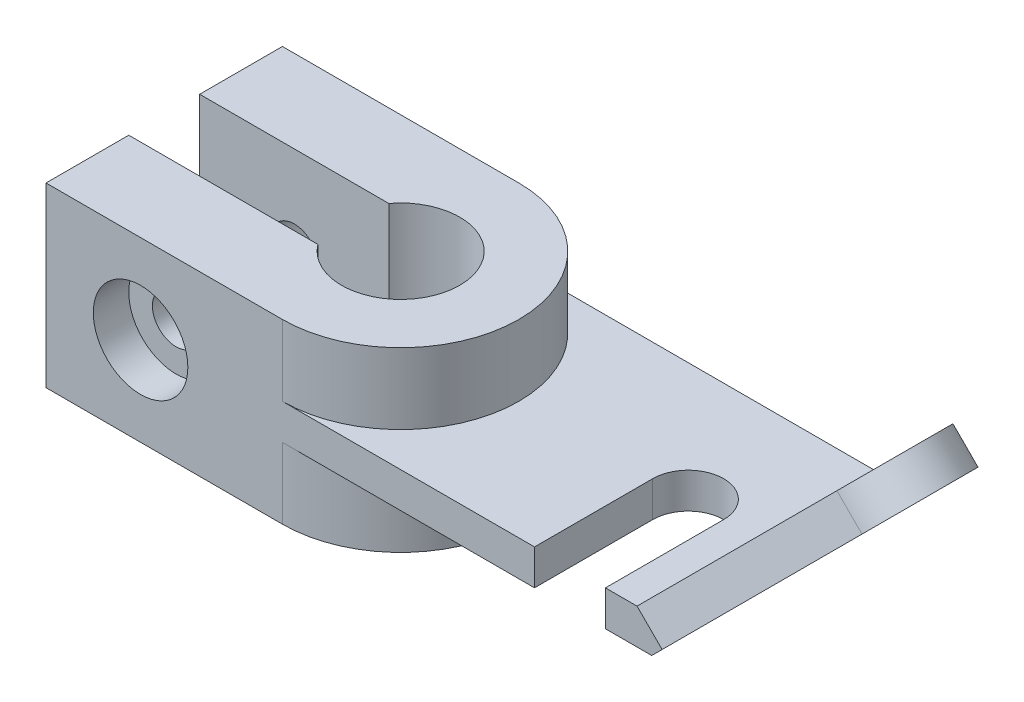
ISO-10303-21;
HEADER;
FILE_DESCRIPTION(('STEP AP214'),'2;1');
FILE_NAME('part.step','',(''),(''),'','','');
FILE_SCHEMA(('AUTOMOTIVE_DESIGN { 1 0 10303 214 1 1 1 1 }'));
ENDSEC;
DATA;
#1=APPLICATION_CONTEXT('core data for automotive mechanical design processes');
#2=APPLICATION_PROTOCOL_DEFINITION('international standard','automotive_design',2000,#1);
#3=PRODUCT_CONTEXT('',#1,'mechanical');
#4=PRODUCT('Part','Part','',(#3));
#5=PRODUCT_RELATED_PRODUCT_CATEGORY('part','',(#4));
#6=PRODUCT_DEFINITION_FORMATION('','',#4);
#7=PRODUCT_DEFINITION_CONTEXT('part definition',#1,'design');
#8=PRODUCT_DEFINITION('design','',#6,#7);
#9=PRODUCT_DEFINITION_SHAPE('','',#8);
#10=(LENGTH_UNIT() NAMED_UNIT(*) SI_UNIT(.MILLI.,.METRE.));
#11=(NAMED_UNIT(*) PLANE_ANGLE_UNIT() SI_UNIT($,.RADIAN.));
#12=(NAMED_UNIT(*) SI_UNIT($,.STERADIAN.) SOLID_ANGLE_UNIT());
#13=UNCERTAINTY_MEASURE_WITH_UNIT(LENGTH_MEASURE(1.E-05),#10,'distance_accuracy_value','');
#14=(GEOMETRIC_REPRESENTATION_CONTEXT(3) GLOBAL_UNCERTAINTY_ASSIGNED_CONTEXT((#13)) GLOBAL_UNIT_ASSIGNED_CONTEXT((#10,
#11,#12)) REPRESENTATION_CONTEXT('',''));
#15=CARTESIAN_POINT('',(0.,0.,0.));
#16=DIRECTION('',(0.,0.,1.));
#17=DIRECTION('',(1.,0.,0.));
#18=AXIS2_PLACEMENT_3D('',#15,#16,#17);
#19=CARTESIAN_POINT('',(0.,45.,30.));
#20=DIRECTION('',(0.,0.,-1.));
#21=DIRECTION('',(-1.,0.,0.));
#22=AXIS2_PLACEMENT_3D('',#19,#20,#21);
#23=PLANE('',#22);
#24=DIRECTION('',(1.,0.,0.));
#25=VECTOR('',#24,1.);
#26=CARTESIAN_POINT('',(90.,27.,30.));
#27=LINE('',#26,#25);
#28=CARTESIAN_POINT('',(81.9798487078312,27.,30.));
#29=VERTEX_POINT('',#28);
#30=CARTESIAN_POINT('',(90.,27.,30.));
#31=VERTEX_POINT('',#30);
#32=EDGE_CURVE('E248',#29,#31,#27,.T.);
#33=ORIENTED_EDGE('',*,*,#32,.F.);
#34=DIRECTION('',(0.,1.,0.));
#35=VECTOR('',#34,1.);
#36=CARTESIAN_POINT('',(81.9798487078312,0.,30.));
#37=LINE('',#36,#35);
#38=CARTESIAN_POINT('',(81.9798487078312,18.,30.));
#39=VERTEX_POINT('',#38);
#40=EDGE_CURVE('E186',#39,#29,#37,.T.);
#41=ORIENTED_EDGE('',*,*,#40,.F.);
#42=DIRECTION('',(1.,0.,0.));
#43=VECTOR('',#42,1.);
#44=CARTESIAN_POINT('',(90.,18.,30.));
#45=LINE('',#44,#43);
#46=CARTESIAN_POINT('',(90.,18.,30.));
#47=VERTEX_POINT('',#46);
#48=EDGE_CURVE('E260',#39,#47,#45,.T.);
#49=ORIENTED_EDGE('',*,*,#48,.T.);
#50=DIRECTION('',(1.,0.,0.));
#51=VECTOR('',#50,1.);
#52=CARTESIAN_POINT('',(0.,17.9999999999998,30.));
#53=LINE('',#52,#51);
#54=CARTESIAN_POINT('',(93.7279220613579,18.,30.));
#55=VERTEX_POINT('',#54);
#56=EDGE_CURVE('E209',#47,#55,#53,.T.);
#57=ORIENTED_EDGE('',*,*,#56,.T.);
#58=DIRECTION('',(0.707106781186546,0.707106781186549,0.));
#59=VECTOR('',#58,1.);
#60=CARTESIAN_POINT('',(90.0000000000001,14.2720779386421,30.));
#61=LINE('',#60,#59);
#62=CARTESIAN_POINT('',(96.363961030679,20.6360389693211,30.));
#63=VERTEX_POINT('',#62);
#64=EDGE_CURVE('E240',#55,#63,#61,.T.);
#65=ORIENTED_EDGE('',*,*,#64,.T.);
#66=DIRECTION('',(-0.707106781186549,0.707106781186546,0.));
#67=VECTOR('',#66,1.);
#68=CARTESIAN_POINT('',(96.363961030679,20.6360389693211,30.));
#69=LINE('',#68,#67);
#70=EDGE_CURVE('E234',#63,#31,#69,.T.);
#71=ORIENTED_EDGE('',*,*,#70,.T.);
#72=EDGE_LOOP('',(#33,#41,#49,#57,#65,#71));
#73=FACE_BOUND('',#72,.T.);
#74=ADVANCED_FACE('F35',(#73),#23,.F.);
#75=CARTESIAN_POINT('',(0.,45.,0.));
#76=DIRECTION('',(0.,-1.,0.));
#77=DIRECTION('',(0.,0.,-1.));
#78=AXIS2_PLACEMENT_3D('',#75,#76,#77);
#79=CYLINDRICAL_SURFACE('',#78,30.);
#80=CARTESIAN_POINT('',(0.,18.,0.));
#81=DIRECTION('',(0.,-1.,0.));
#82=DIRECTION('',(0.,0.,1.));
#83=AXIS2_PLACEMENT_3D('',#80,#81,#82);
#84=CIRCLE('',#83,30.);
#85=CARTESIAN_POINT('',(0.,18.,-30.));
#86=VERTEX_POINT('',#85);
#87=CARTESIAN_POINT('',(0.,18.,30.));
#88=VERTEX_POINT('',#87);
#89=EDGE_CURVE('E244',#86,#88,#84,.T.);
#90=ORIENTED_EDGE('',*,*,#89,.T.);
#91=DIRECTION('',(0.,-1.,0.));
#92=VECTOR('',#91,1.);
#93=CARTESIAN_POINT('',(0.,45.,30.));
#94=LINE('',#93,#92);
#95=CARTESIAN_POINT('',(0.,0.,30.));
#96=VERTEX_POINT('',#95);
#97=EDGE_CURVE('E337',#88,#96,#94,.T.);
#98=ORIENTED_EDGE('',*,*,#97,.T.);
#99=CARTESIAN_POINT('',(0.,0.,0.));
#100=DIRECTION('',(0.,1.,0.));
#101=DIRECTION('',(0.,0.,1.));
#102=AXIS2_PLACEMENT_3D('',#99,#100,#101);
#103=CIRCLE('',#102,30.);
#104=CARTESIAN_POINT('',(0.,0.,-30.));
#105=VERTEX_POINT('',#104);
#106=EDGE_CURVE('E317',#96,#105,#103,.T.);
#107=ORIENTED_EDGE('',*,*,#106,.T.);
#108=DIRECTION('',(0.,-1.,0.));
#109=VECTOR('',#108,1.);
#110=CARTESIAN_POINT('',(0.,45.,-30.));
#111=LINE('',#110,#109);
#112=EDGE_CURVE('E333',#86,#105,#111,.T.);
#113=ORIENTED_EDGE('',*,*,#112,.F.);
#114=EDGE_LOOP('',(#90,#98,#107,#113));
#115=FACE_BOUND('',#114,.T.);
#116=ADVANCED_FACE('F365',(#115),#79,.T.);
#117=CARTESIAN_POINT('',(0.,45.,0.));
#118=DIRECTION('',(0.,-1.,0.));
#119=DIRECTION('',(0.,0.,-1.));
#120=AXIS2_PLACEMENT_3D('',#117,#118,#119);
#121=CYLINDRICAL_SURFACE('',#120,15.);
#122=CARTESIAN_POINT('',(0.,0.,0.));
#123=DIRECTION('',(0.,-1.,0.));
#124=DIRECTION('',(0.,0.,1.));
#125=AXIS2_PLACEMENT_3D('',#122,#123,#124);
#126=CIRCLE('',#125,15.);
#127=CARTESIAN_POINT('',(-12.,0.,-9.));
#128=VERTEX_POINT('',#127);
#129=CARTESIAN_POINT('',(-12.,0.,9.));
#130=VERTEX_POINT('',#129);
#131=EDGE_CURVE('E288',#128,#130,#126,.T.);
#132=ORIENTED_EDGE('',*,*,#131,.T.);
#133=DIRECTION('',(0.,-1.,0.));
#134=VECTOR('',#133,1.);
#135=CARTESIAN_POINT('',(-12.,45.,9.));
#136=LINE('',#135,#134);
#137=CARTESIAN_POINT('',(-12.,45.,9.));
#138=VERTEX_POINT('',#137);
#139=EDGE_CURVE('E347',#138,#130,#136,.T.);
#140=ORIENTED_EDGE('',*,*,#139,.F.);
#141=CARTESIAN_POINT('',(0.,45.,0.));
#142=DIRECTION('',(0.,-1.,0.));
#143=DIRECTION('',(0.,0.,1.));
#144=AXIS2_PLACEMENT_3D('',#141,#142,#143);
#145=CIRCLE('',#144,15.);
#146=CARTESIAN_POINT('',(-12.,45.,-9.));
#147=VERTEX_POINT('',#146);
#148=EDGE_CURVE('E289',#147,#138,#145,.T.);
#149=ORIENTED_EDGE('',*,*,#148,.F.);
#150=DIRECTION('',(0.,-1.,0.));
#151=VECTOR('',#150,1.);
#152=CARTESIAN_POINT('',(-12.,45.,-9.));
#153=LINE('',#152,#151);
#154=EDGE_CURVE('E307',#147,#128,#153,.T.);
#155=ORIENTED_EDGE('',*,*,#154,.T.);
#156=EDGE_LOOP('',(#132,#140,#149,#155));
#157=FACE_BOUND('',#156,.T.);
#158=ADVANCED_FACE('F37',(#157),#121,.F.);
#159=CARTESIAN_POINT('',(-60.,45.,9.));
#160=DIRECTION('',(0.,0.,1.));
#161=DIRECTION('',(1.,0.,0.));
#162=AXIS2_PLACEMENT_3D('',#159,#160,#161);
#163=PLANE('',#162);
#164=CARTESIAN_POINT('',(-36.,22.5,9.));
#165=DIRECTION('',(0.,0.,1.));
#166=DIRECTION('',(1.,0.,0.));
#167=AXIS2_PLACEMENT_3D('',#164,#165,#166);
#168=CIRCLE('',#167,5.99999999999999);
#169=CARTESIAN_POINT('',(-30.,22.5,9.));
#170=VERTEX_POINT('',#169);
#171=EDGE_CURVE('E285',#170,#170,#168,.T.);
#172=ORIENTED_EDGE('',*,*,#171,.T.);
#173=EDGE_LOOP('',(#172));
#174=FACE_BOUND('',#173,.T.);
#175=DIRECTION('',(-1.,0.,0.));
#176=VECTOR('',#175,1.);
#177=CARTESIAN_POINT('',(-60.,0.,9.));
#178=LINE('',#177,#176);
#179=CARTESIAN_POINT('',(-60.,0.,9.));
#180=VERTEX_POINT('',#179);
#181=EDGE_CURVE('E310',#130,#180,#178,.T.);
#182=ORIENTED_EDGE('',*,*,#181,.T.);
#183=DIRECTION('',(0.,-1.,0.));
#184=VECTOR('',#183,1.);
#185=CARTESIAN_POINT('',(-60.,45.,9.));
#186=LINE('',#185,#184);
#187=CARTESIAN_POINT('',(-60.,45.,9.));
#188=VERTEX_POINT('',#187);
#189=EDGE_CURVE('E344',#188,#180,#186,.T.);
#190=ORIENTED_EDGE('',*,*,#189,.F.);
#191=DIRECTION('',(-1.,0.,0.));
#192=VECTOR('',#191,1.);
#193=CARTESIAN_POINT('',(-60.,45.,9.));
#194=LINE('',#193,#192);
#195=EDGE_CURVE('E292',#138,#188,#194,.T.);
#196=ORIENTED_EDGE('',*,*,#195,.F.);
#197=ORIENTED_EDGE('',*,*,#139,.T.);
#198=EDGE_LOOP('',(#182,#190,#196,#197));
#199=FACE_BOUND('',#198,.T.);
#200=ADVANCED_FACE('F422',(#174,#199),#163,.F.);
#201=CARTESIAN_POINT('',(-60.,45.,30.));
#202=DIRECTION('',(1.,0.,0.));
#203=DIRECTION('',(0.,0.,-1.));
#204=AXIS2_PLACEMENT_3D('',#201,#202,#203);
#205=PLANE('',#204);
#206=DIRECTION('',(0.,0.,1.));
#207=VECTOR('',#206,1.);
#208=CARTESIAN_POINT('',(-60.,0.,30.));
#209=LINE('',#208,#207);
#210=CARTESIAN_POINT('',(-60.,0.,30.));
#211=VERTEX_POINT('',#210);
#212=EDGE_CURVE('E312',#180,#211,#209,.T.);
#213=ORIENTED_EDGE('',*,*,#212,.T.);
#214=DIRECTION('',(0.,-1.,0.));
#215=VECTOR('',#214,1.);
#216=CARTESIAN_POINT('',(-60.,45.,30.));
#217=LINE('',#216,#215);
#218=CARTESIAN_POINT('',(-60.,45.,30.));
#219=VERTEX_POINT('',#218);
#220=EDGE_CURVE('E341',#219,#211,#217,.T.);
#221=ORIENTED_EDGE('',*,*,#220,.F.);
#222=DIRECTION('',(0.,0.,1.));
#223=VECTOR('',#222,1.);
#224=CARTESIAN_POINT('',(-60.,45.,30.));
#225=LINE('',#224,#223);
#226=EDGE_CURVE('E295',#188,#219,#225,.T.);
#227=ORIENTED_EDGE('',*,*,#226,.F.);
#228=ORIENTED_EDGE('',*,*,#189,.T.);
#229=EDGE_LOOP('',(#213,#221,#227,#228));
#230=FACE_BOUND('',#229,.T.);
#231=ADVANCED_FACE('F416',(#230),#205,.F.);
#232=CARTESIAN_POINT('',(63.9798487078312,18.,30.));
#233=VERTEX_POINT('',#232);
#234=EDGE_CURVE('E261',#88,#233,#45,.T.);
#235=ORIENTED_EDGE('',*,*,#234,.T.);
#236=DIRECTION('',(0.,1.,0.));
#237=VECTOR('',#236,1.);
#238=CARTESIAN_POINT('',(63.9798487078312,0.,30.));
#239=LINE('',#238,#237);
#240=CARTESIAN_POINT('',(63.9798487078312,27.,30.));
#241=VERTEX_POINT('',#240);
#242=EDGE_CURVE('E197',#233,#241,#239,.T.);
#243=ORIENTED_EDGE('',*,*,#242,.T.);
#244=CARTESIAN_POINT('',(0.,27.,30.));
#245=VERTEX_POINT('',#244);
#246=EDGE_CURVE('E250',#245,#241,#27,.T.);
#247=ORIENTED_EDGE('',*,*,#246,.F.);
#248=CARTESIAN_POINT('',(0.,45.,30.));
#249=VERTEX_POINT('',#248);
#250=EDGE_CURVE('E338',#249,#245,#94,.T.);
#251=ORIENTED_EDGE('',*,*,#250,.F.);
#252=DIRECTION('',(1.,0.,0.));
#253=VECTOR('',#252,1.);
#254=CARTESIAN_POINT('',(0.,45.,30.));
#255=LINE('',#254,#253);
#256=EDGE_CURVE('E297',#219,#249,#255,.T.);
#257=ORIENTED_EDGE('',*,*,#256,.F.);
#258=ORIENTED_EDGE('',*,*,#220,.T.);
#259=DIRECTION('',(1.,0.,0.));
#260=VECTOR('',#259,1.);
#261=CARTESIAN_POINT('',(0.,0.,30.));
#262=LINE('',#261,#260);
#263=EDGE_CURVE('E314',#211,#96,#262,.T.);
#264=ORIENTED_EDGE('',*,*,#263,.T.);
#265=ORIENTED_EDGE('',*,*,#97,.F.);
#266=EDGE_LOOP('',(#235,#243,#247,#251,#257,#258,#264,#265));
#267=FACE_BOUND('',#266,.T.);
#268=CARTESIAN_POINT('',(-36.,22.5,30.));
#269=DIRECTION('',(0.,0.,1.));
#270=DIRECTION('',(1.,0.,0.));
#271=AXIS2_PLACEMENT_3D('',#268,#269,#270);
#272=CIRCLE('',#271,12.);
#273=CARTESIAN_POINT('',(-24.,22.5,30.));
#274=VERTEX_POINT('',#273);
#275=EDGE_CURVE('E276',#274,#274,#272,.T.);
#276=ORIENTED_EDGE('',*,*,#275,.F.);
#277=EDGE_LOOP('',(#276));
#278=FACE_BOUND('',#277,.T.);
#279=ADVANCED_FACE('F360',(#267,#278),#23,.F.);
#280=ORIENTED_EDGE('',*,*,#250,.T.);
#281=CARTESIAN_POINT('',(0.,27.,0.));
#282=DIRECTION('',(0.,-1.,0.));
#283=DIRECTION('',(0.,0.,1.));
#284=AXIS2_PLACEMENT_3D('',#281,#282,#283);
#285=CIRCLE('',#284,30.);
#286=CARTESIAN_POINT('',(0.,27.,-30.));
#287=VERTEX_POINT('',#286);
#288=EDGE_CURVE('E245',#287,#245,#285,.T.);
#289=ORIENTED_EDGE('',*,*,#288,.F.);
#290=CARTESIAN_POINT('',(0.,45.,-30.));
#291=VERTEX_POINT('',#290);
#292=EDGE_CURVE('E334',#291,#287,#111,.T.);
#293=ORIENTED_EDGE('',*,*,#292,.F.);
#294=CARTESIAN_POINT('',(0.,45.,0.));
#295=DIRECTION('',(0.,1.,0.));
#296=DIRECTION('',(0.,0.,1.));
#297=AXIS2_PLACEMENT_3D('',#294,#295,#296);
#298=CIRCLE('',#297,30.);
#299=EDGE_CURVE('E299',#249,#291,#298,.T.);
#300=ORIENTED_EDGE('',*,*,#299,.F.);
#301=EDGE_LOOP('',(#280,#289,#293,#300));
#302=FACE_BOUND('',#301,.T.);
#303=ADVANCED_FACE('F413',(#302),#79,.T.);
#304=CARTESIAN_POINT('',(0.,45.,-30.));
#305=DIRECTION('',(0.,0.,1.));
#306=DIRECTION('',(1.,0.,0.));
#307=AXIS2_PLACEMENT_3D('',#304,#305,#306);
#308=PLANE('',#307);
#309=DIRECTION('',(-1.,0.,0.));
#310=VECTOR('',#309,1.);
#311=CARTESIAN_POINT('',(0.,17.9999999999998,-30.));
#312=LINE('',#311,#310);
#313=CARTESIAN_POINT('',(93.7279220613579,18.,-30.));
#314=VERTEX_POINT('',#313);
#315=CARTESIAN_POINT('',(90.,18.,-30.));
#316=VERTEX_POINT('',#315);
#317=EDGE_CURVE('E58',#314,#316,#312,.T.);
#318=ORIENTED_EDGE('',*,*,#317,.T.);
#319=DIRECTION('',(-1.,0.,0.));
#320=VECTOR('',#319,1.);
#321=CARTESIAN_POINT('',(0.,18.,-30.));
#322=LINE('',#321,#320);
#323=EDGE_CURVE('E249',#316,#86,#322,.T.);
#324=ORIENTED_EDGE('',*,*,#323,.T.);
#325=ORIENTED_EDGE('',*,*,#112,.T.);
#326=DIRECTION('',(-1.,0.,0.));
#327=VECTOR('',#326,1.);
#328=CARTESIAN_POINT('',(0.,0.,-30.));
#329=LINE('',#328,#327);
#330=CARTESIAN_POINT('',(-60.,0.,-30.));
#331=VERTEX_POINT('',#330);
#332=EDGE_CURVE('E320',#105,#331,#329,.T.);
#333=ORIENTED_EDGE('',*,*,#332,.T.);
#334=DIRECTION('',(0.,-1.,0.));
#335=VECTOR('',#334,1.);
#336=CARTESIAN_POINT('',(-60.,45.,-30.));
#337=LINE('',#336,#335);
#338=CARTESIAN_POINT('',(-60.,45.,-30.));
#339=VERTEX_POINT('',#338);
#340=EDGE_CURVE('E330',#339,#331,#337,.T.);
#341=ORIENTED_EDGE('',*,*,#340,.F.);
#342=DIRECTION('',(-1.,0.,0.));
#343=VECTOR('',#342,1.);
#344=CARTESIAN_POINT('',(0.,45.,-30.));
#345=LINE('',#344,#343);
#346=EDGE_CURVE('E301',#291,#339,#345,.T.);
#347=ORIENTED_EDGE('',*,*,#346,.F.);
#348=ORIENTED_EDGE('',*,*,#292,.T.);
#349=DIRECTION('',(-1.,0.,0.));
#350=VECTOR('',#349,1.);
#351=CARTESIAN_POINT('',(0.,27.,-30.));
#352=LINE('',#351,#350);
#353=CARTESIAN_POINT('',(90.,27.,-30.));
#354=VERTEX_POINT('',#353);
#355=EDGE_CURVE('E255',#354,#287,#352,.T.);
#356=ORIENTED_EDGE('',*,*,#355,.F.);
#357=DIRECTION('',(0.707106781186549,-0.707106781186546,0.));
#358=VECTOR('',#357,1.);
#359=CARTESIAN_POINT('',(90.,27.,-30.));
#360=LINE('',#359,#358);
#361=CARTESIAN_POINT('',(96.363961030679,20.6360389693211,-30.));
#362=VERTEX_POINT('',#361);
#363=EDGE_CURVE('E237',#354,#362,#360,.T.);
#364=ORIENTED_EDGE('',*,*,#363,.T.);
#365=DIRECTION('',(0.707106781186546,0.707106781186549,0.));
#366=VECTOR('',#365,1.);
#367=CARTESIAN_POINT('',(90.0000000000001,14.2720779386421,-30.));
#368=LINE('',#367,#366);
#369=EDGE_CURVE('E242',#314,#362,#368,.T.);
#370=ORIENTED_EDGE('',*,*,#369,.F.);
#371=EDGE_LOOP('',(#318,#324,#325,#333,#341,#347,#348,#356,#364,#370));
#372=FACE_BOUND('',#371,.T.);
#373=CARTESIAN_POINT('',(-36.,22.5,-30.));
#374=DIRECTION('',(0.,0.,-1.));
#375=DIRECTION('',(-1.,0.,0.));
#376=AXIS2_PLACEMENT_3D('',#373,#374,#375);
#377=CIRCLE('',#376,12.);
#378=CARTESIAN_POINT('',(-48.,22.5,-30.));
#379=VERTEX_POINT('',#378);
#380=EDGE_CURVE('E257',#379,#379,#377,.T.);
#381=ORIENTED_EDGE('',*,*,#380,.F.);
#382=EDGE_LOOP('',(#381));
#383=FACE_BOUND('',#382,.T.);
#384=ADVANCED_FACE('F373',(#372,#383),#308,.F.);
#385=CARTESIAN_POINT('',(-60.,45.,-30.));
#386=DIRECTION('',(1.,0.,0.));
#387=DIRECTION('',(0.,0.,-1.));
#388=AXIS2_PLACEMENT_3D('',#385,#386,#387);
#389=PLANE('',#388);
#390=DIRECTION('',(0.,0.,1.));
#391=VECTOR('',#390,1.);
#392=CARTESIAN_POINT('',(-60.,0.,-30.));
#393=LINE('',#392,#391);
#394=CARTESIAN_POINT('',(-60.,0.,-8.99999999999999));
#395=VERTEX_POINT('',#394);
#396=EDGE_CURVE('E322',#331,#395,#393,.T.);
#397=ORIENTED_EDGE('',*,*,#396,.T.);
#398=DIRECTION('',(0.,-1.,0.));
#399=VECTOR('',#398,1.);
#400=CARTESIAN_POINT('',(-60.,45.,-8.99999999999999));
#401=LINE('',#400,#399);
#402=CARTESIAN_POINT('',(-60.,45.,-8.99999999999999));
#403=VERTEX_POINT('',#402);
#404=EDGE_CURVE('E327',#403,#395,#401,.T.);
#405=ORIENTED_EDGE('',*,*,#404,.F.);
#406=DIRECTION('',(0.,0.,1.));
#407=VECTOR('',#406,1.);
#408=CARTESIAN_POINT('',(-60.,45.,-30.));
#409=LINE('',#408,#407);
#410=EDGE_CURVE('E303',#339,#403,#409,.T.);
#411=ORIENTED_EDGE('',*,*,#410,.F.);
#412=ORIENTED_EDGE('',*,*,#340,.T.);
#413=EDGE_LOOP('',(#397,#405,#411,#412));
#414=FACE_BOUND('',#413,.T.);
#415=ADVANCED_FACE('F443',(#414),#389,.F.);
#416=CARTESIAN_POINT('',(-60.,45.,-8.99999999999999));
#417=DIRECTION('',(0.,0.,-1.));
#418=DIRECTION('',(-1.,0.,0.));
#419=AXIS2_PLACEMENT_3D('',#416,#417,#418);
#420=PLANE('',#419);
#421=CARTESIAN_POINT('',(-36.,22.5,-9.));
#422=DIRECTION('',(0.,0.,-1.));
#423=DIRECTION('',(-1.,0.,0.));
#424=AXIS2_PLACEMENT_3D('',#421,#422,#423);
#425=CIRCLE('',#424,5.99999999999999);
#426=CARTESIAN_POINT('',(-42.,22.5,-9.));
#427=VERTEX_POINT('',#426);
#428=EDGE_CURVE('E273',#427,#427,#425,.T.);
#429=ORIENTED_EDGE('',*,*,#428,.T.);
#430=EDGE_LOOP('',(#429));
#431=FACE_BOUND('',#430,.T.);
#432=DIRECTION('',(1.,0.,0.));
#433=VECTOR('',#432,1.);
#434=CARTESIAN_POINT('',(-60.,0.,-8.99999999999999));
#435=LINE('',#434,#433);
#436=EDGE_CURVE('E293',#395,#128,#435,.T.);
#437=ORIENTED_EDGE('',*,*,#436,.T.);
#438=ORIENTED_EDGE('',*,*,#154,.F.);
#439=DIRECTION('',(1.,0.,0.));
#440=VECTOR('',#439,1.);
#441=CARTESIAN_POINT('',(-60.,45.,-8.99999999999999));
#442=LINE('',#441,#440);
#443=EDGE_CURVE('E305',#403,#147,#442,.T.);
#444=ORIENTED_EDGE('',*,*,#443,.F.);
#445=ORIENTED_EDGE('',*,*,#404,.T.);
#446=EDGE_LOOP('',(#437,#438,#444,#445));
#447=FACE_BOUND('',#446,.T.);
#448=ADVANCED_FACE('F457',(#431,#447),#420,.F.);
#449=CARTESIAN_POINT('',(0.,45.,0.));
#450=DIRECTION('',(0.,1.,0.));
#451=DIRECTION('',(0.,0.,1.));
#452=AXIS2_PLACEMENT_3D('',#449,#450,#451);
#453=PLANE('',#452);
#454=ORIENTED_EDGE('',*,*,#148,.T.);
#455=ORIENTED_EDGE('',*,*,#195,.T.);
#456=ORIENTED_EDGE('',*,*,#226,.T.);
#457=ORIENTED_EDGE('',*,*,#256,.T.);
#458=ORIENTED_EDGE('',*,*,#299,.T.);
#459=ORIENTED_EDGE('',*,*,#346,.T.);
#460=ORIENTED_EDGE('',*,*,#410,.T.);
#461=ORIENTED_EDGE('',*,*,#443,.T.);
#462=EDGE_LOOP('',(#454,#455,#456,#457,#458,#459,#460,#461));
#463=FACE_BOUND('',#462,.T.);
#464=ADVANCED_FACE('F447',(#463),#453,.T.);
#465=CARTESIAN_POINT('',(0.,0.,0.));
#466=DIRECTION('',(0.,1.,0.));
#467=DIRECTION('',(0.,0.,1.));
#468=AXIS2_PLACEMENT_3D('',#465,#466,#467);
#469=PLANE('',#468);
#470=ORIENTED_EDGE('',*,*,#131,.F.);
#471=ORIENTED_EDGE('',*,*,#436,.F.);
#472=ORIENTED_EDGE('',*,*,#396,.F.);
#473=ORIENTED_EDGE('',*,*,#332,.F.);
#474=ORIENTED_EDGE('',*,*,#106,.F.);
#475=ORIENTED_EDGE('',*,*,#263,.F.);
#476=ORIENTED_EDGE('',*,*,#212,.F.);
#477=ORIENTED_EDGE('',*,*,#181,.F.);
#478=EDGE_LOOP('',(#470,#471,#472,#473,#474,#475,#476,#477));
#479=FACE_BOUND('',#478,.T.);
#480=ADVANCED_FACE('F436',(#479),#469,.F.);
#481=CARTESIAN_POINT('',(-36.,22.5,30.));
#482=DIRECTION('',(0.,0.,1.));
#483=DIRECTION('',(1.,0.,0.));
#484=AXIS2_PLACEMENT_3D('',#481,#482,#483);
#485=CYLINDRICAL_SURFACE('',#484,5.99999999999999);
#486=ORIENTED_EDGE('',*,*,#171,.F.);
#487=EDGE_LOOP('',(#486));
#488=FACE_BOUND('',#487,.T.);
#489=CARTESIAN_POINT('',(-36.,22.5,21.));
#490=DIRECTION('',(0.,0.,1.));
#491=DIRECTION('',(1.,0.,0.));
#492=AXIS2_PLACEMENT_3D('',#489,#490,#491);
#493=CIRCLE('',#492,5.99999999999999);
#494=CARTESIAN_POINT('',(-30.,22.5,21.));
#495=VERTEX_POINT('',#494);
#496=EDGE_CURVE('E282',#495,#495,#493,.T.);
#497=ORIENTED_EDGE('',*,*,#496,.T.);
#498=EDGE_LOOP('',(#497));
#499=FACE_BOUND('',#498,.T.);
#500=ADVANCED_FACE('F500',(#488,#499),#485,.F.);
#501=CARTESIAN_POINT('',(-30.,22.5,21.));
#502=DIRECTION('',(0.,0.,-1.));
#503=DIRECTION('',(-1.,0.,0.));
#504=AXIS2_PLACEMENT_3D('',#501,#502,#503);
#505=PLANE('',#504);
#506=ORIENTED_EDGE('',*,*,#496,.F.);
#507=EDGE_LOOP('',(#506));
#508=FACE_BOUND('',#507,.T.);
#509=CARTESIAN_POINT('',(-36.,22.5,21.));
#510=DIRECTION('',(0.,0.,1.));
#511=DIRECTION('',(1.,0.,0.));
#512=AXIS2_PLACEMENT_3D('',#509,#510,#511);
#513=CIRCLE('',#512,12.);
#514=CARTESIAN_POINT('',(-24.,22.5,21.));
#515=VERTEX_POINT('',#514);
#516=EDGE_CURVE('E279',#515,#515,#513,.T.);
#517=ORIENTED_EDGE('',*,*,#516,.T.);
#518=EDGE_LOOP('',(#517));
#519=FACE_BOUND('',#518,.T.);
#520=ADVANCED_FACE('F516',(#508,#519),#505,.F.);
#521=CARTESIAN_POINT('',(-36.,22.5,30.));
#522=DIRECTION('',(0.,0.,1.));
#523=DIRECTION('',(1.,0.,0.));
#524=AXIS2_PLACEMENT_3D('',#521,#522,#523);
#525=CYLINDRICAL_SURFACE('',#524,12.);
#526=ORIENTED_EDGE('',*,*,#516,.F.);
#527=EDGE_LOOP('',(#526));
#528=FACE_BOUND('',#527,.T.);
#529=ORIENTED_EDGE('',*,*,#275,.T.);
#530=EDGE_LOOP('',(#529));
#531=FACE_BOUND('',#530,.T.);
#532=ADVANCED_FACE('F526',(#528,#531),#525,.F.);
#533=CARTESIAN_POINT('',(-36.,22.5,-30.));
#534=DIRECTION('',(0.,0.,-1.));
#535=DIRECTION('',(-1.,0.,0.));
#536=AXIS2_PLACEMENT_3D('',#533,#534,#535);
#537=CYLINDRICAL_SURFACE('',#536,5.99999999999999);
#538=ORIENTED_EDGE('',*,*,#428,.F.);
#539=EDGE_LOOP('',(#538));
#540=FACE_BOUND('',#539,.T.);
#541=CARTESIAN_POINT('',(-36.,22.5,-21.));
#542=DIRECTION('',(0.,0.,-1.));
#543=DIRECTION('',(-1.,0.,0.));
#544=AXIS2_PLACEMENT_3D('',#541,#542,#543);
#545=CIRCLE('',#544,5.99999999999999);
#546=CARTESIAN_POINT('',(-42.,22.5,-21.));
#547=VERTEX_POINT('',#546);
#548=EDGE_CURVE('E270',#547,#547,#545,.T.);
#549=ORIENTED_EDGE('',*,*,#548,.T.);
#550=EDGE_LOOP('',(#549));
#551=FACE_BOUND('',#550,.T.);
#552=ADVANCED_FACE('F535',(#540,#551),#537,.F.);
#553=CARTESIAN_POINT('',(-30.,22.5,-21.));
#554=DIRECTION('',(0.,0.,1.));
#555=DIRECTION('',(1.,0.,0.));
#556=AXIS2_PLACEMENT_3D('',#553,#554,#555);
#557=PLANE('',#556);
#558=ORIENTED_EDGE('',*,*,#548,.F.);
#559=EDGE_LOOP('',(#558));
#560=FACE_BOUND('',#559,.T.);
#561=CARTESIAN_POINT('',(-36.,22.5,-21.));
#562=DIRECTION('',(0.,0.,-1.));
#563=DIRECTION('',(-1.,0.,0.));
#564=AXIS2_PLACEMENT_3D('',#561,#562,#563);
#565=CIRCLE('',#564,12.);
#566=CARTESIAN_POINT('',(-48.,22.5,-21.));
#567=VERTEX_POINT('',#566);
#568=EDGE_CURVE('E267',#567,#567,#565,.T.);
#569=ORIENTED_EDGE('',*,*,#568,.T.);
#570=EDGE_LOOP('',(#569));
#571=FACE_BOUND('',#570,.T.);
#572=ADVANCED_FACE('F549',(#560,#571),#557,.F.);
#573=CARTESIAN_POINT('',(-36.,22.5,-30.));
#574=DIRECTION('',(0.,0.,-1.));
#575=DIRECTION('',(-1.,0.,0.));
#576=AXIS2_PLACEMENT_3D('',#573,#574,#575);
#577=CYLINDRICAL_SURFACE('',#576,12.);
#578=ORIENTED_EDGE('',*,*,#568,.F.);
#579=EDGE_LOOP('',(#578));
#580=FACE_BOUND('',#579,.T.);
#581=ORIENTED_EDGE('',*,*,#380,.T.);
#582=EDGE_LOOP('',(#581));
#583=FACE_BOUND('',#582,.T.);
#584=ADVANCED_FACE('F559',(#580,#583),#577,.F.);
#585=CARTESIAN_POINT('',(0.,27.,0.));
#586=DIRECTION('',(0.,1.,0.));
#587=DIRECTION('',(0.,0.,1.));
#588=AXIS2_PLACEMENT_3D('',#585,#586,#587);
#589=PLANE('',#588);
#590=DIRECTION('',(0.,0.,-1.));
#591=VECTOR('',#590,1.);
#592=CARTESIAN_POINT('',(81.9798487078312,27.,0.));
#593=LINE('',#592,#591);
#594=CARTESIAN_POINT('',(81.9798487078312,27.,0.));
#595=VERTEX_POINT('',#594);
#596=EDGE_CURVE('E183',#29,#595,#593,.T.);
#597=ORIENTED_EDGE('',*,*,#596,.F.);
#598=ORIENTED_EDGE('',*,*,#32,.T.);
#599=DIRECTION('',(0.,0.,-1.));
#600=VECTOR('',#599,1.);
#601=CARTESIAN_POINT('',(90.,27.,-30.));
#602=LINE('',#601,#600);
#603=EDGE_CURVE('E252',#31,#354,#602,.T.);
#604=ORIENTED_EDGE('',*,*,#603,.T.);
#605=ORIENTED_EDGE('',*,*,#355,.T.);
#606=ORIENTED_EDGE('',*,*,#288,.T.);
#607=ORIENTED_EDGE('',*,*,#246,.T.);
#608=DIRECTION('',(0.,0.,1.));
#609=VECTOR('',#608,1.);
#610=CARTESIAN_POINT('',(63.9798487078312,27.,0.));
#611=LINE('',#610,#609);
#612=CARTESIAN_POINT('',(63.9798487078312,27.,0.));
#613=VERTEX_POINT('',#612);
#614=EDGE_CURVE('E180',#613,#241,#611,.T.);
#615=ORIENTED_EDGE('',*,*,#614,.F.);
#616=CARTESIAN_POINT('',(72.9798487078312,27.,0.));
#617=DIRECTION('',(0.,1.,0.));
#618=DIRECTION('',(0.,0.,1.));
#619=AXIS2_PLACEMENT_3D('',#616,#617,#618);
#620=CIRCLE('',#619,8.99999999999999);
#621=EDGE_CURVE('E175',#595,#613,#620,.T.);
#622=ORIENTED_EDGE('',*,*,#621,.F.);
#623=EDGE_LOOP('',(#597,#598,#604,#605,#606,#607,#615,#622));
#624=FACE_BOUND('',#623,.T.);
#625=ADVANCED_FACE('F190',(#624),#589,.T.);
#626=CARTESIAN_POINT('',(0.,18.,0.));
#627=DIRECTION('',(0.,1.,0.));
#628=DIRECTION('',(0.,0.,1.));
#629=AXIS2_PLACEMENT_3D('',#626,#627,#628);
#630=PLANE('',#629);
#631=ORIENTED_EDGE('',*,*,#48,.F.);
#632=DIRECTION('',(0.,0.,-1.));
#633=VECTOR('',#632,1.);
#634=CARTESIAN_POINT('',(81.9798487078312,18.,0.));
#635=LINE('',#634,#633);
#636=CARTESIAN_POINT('',(81.9798487078312,18.,0.));
#637=VERTEX_POINT('',#636);
#638=EDGE_CURVE('E11',#39,#637,#635,.T.);
#639=ORIENTED_EDGE('',*,*,#638,.T.);
#640=CARTESIAN_POINT('',(72.9798487078312,18.,0.));
#641=DIRECTION('',(0.,1.,0.));
#642=DIRECTION('',(0.,0.,1.));
#643=AXIS2_PLACEMENT_3D('',#640,#641,#642);
#644=CIRCLE('',#643,8.99999999999999);
#645=CARTESIAN_POINT('',(63.9798487078312,18.,0.));
#646=VERTEX_POINT('',#645);
#647=EDGE_CURVE('E178',#637,#646,#644,.T.);
#648=ORIENTED_EDGE('',*,*,#647,.T.);
#649=DIRECTION('',(0.,0.,1.));
#650=VECTOR('',#649,1.);
#651=CARTESIAN_POINT('',(63.9798487078312,18.,0.));
#652=LINE('',#651,#650);
#653=EDGE_CURVE('E43',#646,#233,#652,.T.);
#654=ORIENTED_EDGE('',*,*,#653,.T.);
#655=ORIENTED_EDGE('',*,*,#234,.F.);
#656=ORIENTED_EDGE('',*,*,#89,.F.);
#657=ORIENTED_EDGE('',*,*,#323,.F.);
#658=DIRECTION('',(0.,0.,-1.));
#659=VECTOR('',#658,1.);
#660=CARTESIAN_POINT('',(90.,18.,303.683314770483));
#661=LINE('',#660,#659);
#662=EDGE_CURVE('E206',#47,#316,#661,.T.);
#663=ORIENTED_EDGE('',*,*,#662,.F.);
#664=EDGE_LOOP('',(#631,#639,#648,#654,#655,#656,#657,#663));
#665=FACE_BOUND('',#664,.T.);
#666=ADVANCED_FACE('F355',(#665),#630,.F.);
#667=CARTESIAN_POINT('',(90.0000000000001,14.2720779386421,-30.));
#668=DIRECTION('',(-0.707106781186549,0.707106781186546,0.));
#669=DIRECTION('',(-0.707106781186546,-0.707106781186549,0.));
#670=AXIS2_PLACEMENT_3D('',#667,#668,#669);
#671=PLANE('',#670);
#672=CARTESIAN_POINT('',(128.183766184074,52.4558441227158,0.));
#673=DIRECTION('',(-0.707106781186549,0.707106781186546,0.));
#674=DIRECTION('',(-0.707106781186546,-0.707106781186549,0.));
#675=AXIS2_PLACEMENT_3D('',#672,#673,#674);
#676=CIRCLE('',#675,7.5);
#677=CARTESIAN_POINT('',(122.880465325174,47.1525432638167,0.));
#678=VERTEX_POINT('',#677);
#679=EDGE_CURVE('E203',#678,#678,#676,.T.);
#680=ORIENTED_EDGE('',*,*,#679,.T.);
#681=EDGE_LOOP('',(#680));
#682=FACE_BOUND('',#681,.T.);
#683=ORIENTED_EDGE('',*,*,#64,.F.);
#684=DIRECTION('',(0.,0.,-1.));
#685=VECTOR('',#684,1.);
#686=CARTESIAN_POINT('',(93.7279220613579,18.,-30.));
#687=LINE('',#686,#685);
#688=EDGE_CURVE('E350',#55,#314,#687,.T.);
#689=ORIENTED_EDGE('',*,*,#688,.T.);
#690=ORIENTED_EDGE('',*,*,#369,.T.);
#691=DIRECTION('',(0.674052522363278,0.674052522363281,0.302169479251962));
#692=VECTOR('',#691,1.);
#693=CARTESIAN_POINT('',(49.3157280810056,-26.4121939803524,-51.091145835763));
#694=LINE('',#693,#692);
#695=CARTESIAN_POINT('',(131.388757501774,55.6608354404159,-14.2988132831692));
#696=VERTEX_POINT('',#695);
#697=EDGE_CURVE('E213',#362,#696,#694,.T.);
#698=ORIENTED_EDGE('',*,*,#697,.T.);
#699=CARTESIAN_POINT('',(128.183766184074,52.4558441227158,0.));
#700=DIRECTION('',(0.707106781186549,-0.707106781186546,0.));
#701=DIRECTION('',(0.707106781186546,0.707106781186549,0.));
#702=AXIS2_PLACEMENT_3D('',#699,#700,#701);
#703=CIRCLE('',#702,15.);
#704=CARTESIAN_POINT('',(131.388757501774,55.6608354404158,14.2988132831692));
#705=VERTEX_POINT('',#704);
#706=EDGE_CURVE('E216',#696,#705,#703,.T.);
#707=ORIENTED_EDGE('',*,*,#706,.T.);
#708=DIRECTION('',(0.674052522363278,0.674052522363281,-0.302169479251962));
#709=VECTOR('',#708,1.);
#710=CARTESIAN_POINT('',(49.3157280810056,-26.4121939803525,51.091145835763));
#711=LINE('',#710,#709);
#712=EDGE_CURVE('E219',#63,#705,#711,.T.);
#713=ORIENTED_EDGE('',*,*,#712,.F.);
#714=EDGE_LOOP('',(#683,#689,#690,#698,#707,#713));
#715=FACE_BOUND('',#714,.T.);
#716=ADVANCED_FACE('F380',(#682,#715),#671,.F.);
#717=CARTESIAN_POINT('',(49.3157280810056,-26.4121939803524,-51.091145835763));
#718=DIRECTION('',(-0.21366608784667,-0.21366608784667,0.953254218877943));
#719=DIRECTION('',(0.,-0.975788340623371,-0.21871697305762));
#720=AXIS2_PLACEMENT_3D('',#717,#718,#719);
#721=PLANE('',#720);
#722=DIRECTION('',(0.674052522363278,0.674052522363281,0.302169479251962));
#723=VECTOR('',#722,1.);
#724=CARTESIAN_POINT('',(42.9517670503267,-20.0482329496735,-51.091145835763));
#725=LINE('',#724,#723);
#726=CARTESIAN_POINT('',(125.024796471095,62.0247964710948,-14.2988132831692));
#727=VERTEX_POINT('',#726);
#728=EDGE_CURVE('E212',#354,#727,#725,.T.);
#729=ORIENTED_EDGE('',*,*,#728,.T.);
#730=DIRECTION('',(-0.707106781186549,0.707106781186546,0.));
#731=VECTOR('',#730,1.);
#732=CARTESIAN_POINT('',(131.388757501774,55.6608354404159,-14.2988132831692));
#733=LINE('',#732,#731);
#734=EDGE_CURVE('E231',#696,#727,#733,.T.);
#735=ORIENTED_EDGE('',*,*,#734,.F.);
#736=ORIENTED_EDGE('',*,*,#697,.F.);
#737=ORIENTED_EDGE('',*,*,#363,.F.);
#738=EDGE_LOOP('',(#729,#735,#736,#737));
#739=FACE_BOUND('',#738,.T.);
#740=ADVANCED_FACE('F383',(#739),#721,.F.);
#741=CARTESIAN_POINT('',(128.183766184074,52.4558441227158,0.));
#742=DIRECTION('',(-0.707106781186549,0.707106781186546,0.));
#743=DIRECTION('',(-0.707106781186546,-0.707106781186549,0.));
#744=AXIS2_PLACEMENT_3D('',#741,#742,#743);
#745=CYLINDRICAL_SURFACE('',#744,15.);
#746=CARTESIAN_POINT('',(121.819805153395,58.8198051533947,0.));
#747=DIRECTION('',(0.707106781186549,-0.707106781186546,0.));
#748=DIRECTION('',(0.707106781186546,0.707106781186549,0.));
#749=AXIS2_PLACEMENT_3D('',#746,#747,#748);
#750=CIRCLE('',#749,15.);
#751=CARTESIAN_POINT('',(125.024796471095,62.0247964710947,14.2988132831692));
#752=VERTEX_POINT('',#751);
#753=EDGE_CURVE('E225',#727,#752,#750,.T.);
#754=ORIENTED_EDGE('',*,*,#753,.T.);
#755=DIRECTION('',(-0.707106781186549,0.707106781186546,0.));
#756=VECTOR('',#755,1.);
#757=CARTESIAN_POINT('',(131.388757501774,55.6608354404158,14.2988132831692));
#758=LINE('',#757,#756);
#759=EDGE_CURVE('E222',#705,#752,#758,.T.);
#760=ORIENTED_EDGE('',*,*,#759,.F.);
#761=ORIENTED_EDGE('',*,*,#706,.F.);
#762=ORIENTED_EDGE('',*,*,#734,.T.);
#763=EDGE_LOOP('',(#754,#760,#761,#762));
#764=FACE_BOUND('',#763,.T.);
#765=ADVANCED_FACE('F385',(#764),#745,.T.);
#766=CARTESIAN_POINT('',(49.3157280810056,-26.4121939803525,51.091145835763));
#767=DIRECTION('',(0.21366608784667,0.21366608784667,0.953254218877943));
#768=DIRECTION('',(0.,-0.975788340623371,0.21871697305762));
#769=AXIS2_PLACEMENT_3D('',#766,#767,#768);
#770=PLANE('',#769);
#771=DIRECTION('',(0.674052522363278,0.674052522363281,-0.302169479251962));
#772=VECTOR('',#771,1.);
#773=CARTESIAN_POINT('',(42.9517670503267,-20.0482329496735,51.091145835763));
#774=LINE('',#773,#772);
#775=EDGE_CURVE('E217',#31,#752,#774,.T.);
#776=ORIENTED_EDGE('',*,*,#775,.F.);
#777=ORIENTED_EDGE('',*,*,#70,.F.);
#778=ORIENTED_EDGE('',*,*,#712,.T.);
#779=ORIENTED_EDGE('',*,*,#759,.T.);
#780=EDGE_LOOP('',(#776,#777,#778,#779));
#781=FACE_BOUND('',#780,.T.);
#782=ADVANCED_FACE('F391',(#781),#770,.T.);
#783=CARTESIAN_POINT('',(31.5000000000002,-31.5000000000001,0.));
#784=DIRECTION('',(0.707106781186549,-0.707106781186546,0.));
#785=DIRECTION('',(0.707106781186546,0.707106781186549,0.));
#786=AXIS2_PLACEMENT_3D('',#783,#784,#785);
#787=PLANE('',#786);
#788=CARTESIAN_POINT('',(121.819805153395,58.8198051533947,0.));
#789=DIRECTION('',(-0.707106781186549,0.707106781186546,0.));
#790=DIRECTION('',(-0.707106781186546,-0.707106781186549,0.));
#791=AXIS2_PLACEMENT_3D('',#788,#789,#790);
#792=CIRCLE('',#791,7.5);
#793=CARTESIAN_POINT('',(116.516504294496,53.5165042944956,0.));
#794=VERTEX_POINT('',#793);
#795=EDGE_CURVE('E196',#794,#794,#792,.T.);
#796=ORIENTED_EDGE('',*,*,#795,.F.);
#797=EDGE_LOOP('',(#796));
#798=FACE_BOUND('',#797,.T.);
#799=ORIENTED_EDGE('',*,*,#728,.F.);
#800=ORIENTED_EDGE('',*,*,#603,.F.);
#801=ORIENTED_EDGE('',*,*,#775,.T.);
#802=ORIENTED_EDGE('',*,*,#753,.F.);
#803=EDGE_LOOP('',(#799,#800,#801,#802));
#804=FACE_BOUND('',#803,.T.);
#805=ADVANCED_FACE('F395',(#798,#804),#787,.F.);
#806=CARTESIAN_POINT('',(90.,18.,303.683314770483));
#807=DIRECTION('',(0.,1.,0.));
#808=DIRECTION('',(-1.,0.,0.));
#809=AXIS2_PLACEMENT_3D('',#806,#807,#808);
#810=PLANE('',#809);
#811=ORIENTED_EDGE('',*,*,#56,.F.);
#812=ORIENTED_EDGE('',*,*,#662,.T.);
#813=ORIENTED_EDGE('',*,*,#317,.F.);
#814=ORIENTED_EDGE('',*,*,#688,.F.);
#815=EDGE_LOOP('',(#811,#812,#813,#814));
#816=FACE_BOUND('',#815,.T.);
#817=ADVANCED_FACE('F371',(#816),#810,.F.);
#818=CARTESIAN_POINT('',(159.714989104331,20.9246212024589,0.));
#819=DIRECTION('',(-0.707106781186549,0.707106781186546,0.));
#820=DIRECTION('',(-0.707106781186546,-0.707106781186549,0.));
#821=AXIS2_PLACEMENT_3D('',#818,#819,#820);
#822=CYLINDRICAL_SURFACE('',#821,7.5);
#823=ORIENTED_EDGE('',*,*,#795,.T.);
#824=EDGE_LOOP('',(#823));
#825=FACE_BOUND('',#824,.T.);
#826=ORIENTED_EDGE('',*,*,#679,.F.);
#827=EDGE_LOOP('',(#826));
#828=FACE_BOUND('',#827,.T.);
#829=ADVANCED_FACE('F403',(#825,#828),#822,.F.);
#830=CARTESIAN_POINT('',(81.9798487078312,0.,0.));
#831=DIRECTION('',(1.,0.,0.));
#832=DIRECTION('',(0.,0.,-1.));
#833=AXIS2_PLACEMENT_3D('',#830,#831,#832);
#834=PLANE('',#833);
#835=ORIENTED_EDGE('',*,*,#40,.T.);
#836=ORIENTED_EDGE('',*,*,#596,.T.);
#837=DIRECTION('',(0.,1.,0.));
#838=VECTOR('',#837,1.);
#839=CARTESIAN_POINT('',(81.9798487078312,0.,0.));
#840=LINE('',#839,#838);
#841=EDGE_CURVE('E171',#637,#595,#840,.T.);
#842=ORIENTED_EDGE('',*,*,#841,.F.);
#843=ORIENTED_EDGE('',*,*,#638,.F.);
#844=EDGE_LOOP('',(#835,#836,#842,#843));
#845=FACE_BOUND('',#844,.T.);
#846=ADVANCED_FACE('F184',(#845),#834,.F.);
#847=CARTESIAN_POINT('',(63.9798487078312,0.,0.));
#848=DIRECTION('',(-1.,0.,0.));
#849=DIRECTION('',(0.,0.,1.));
#850=AXIS2_PLACEMENT_3D('',#847,#848,#849);
#851=PLANE('',#850);
#852=DIRECTION('',(0.,1.,0.));
#853=VECTOR('',#852,1.);
#854=CARTESIAN_POINT('',(63.9798487078312,0.,0.));
#855=LINE('',#854,#853);
#856=EDGE_CURVE('E50',#646,#613,#855,.T.);
#857=ORIENTED_EDGE('',*,*,#856,.T.);
#858=ORIENTED_EDGE('',*,*,#614,.T.);
#859=ORIENTED_EDGE('',*,*,#242,.F.);
#860=ORIENTED_EDGE('',*,*,#653,.F.);
#861=EDGE_LOOP('',(#857,#858,#859,#860));
#862=FACE_BOUND('',#861,.T.);
#863=ADVANCED_FACE('F678',(#862),#851,.F.);
#864=CARTESIAN_POINT('',(72.9798487078312,0.,0.));
#865=DIRECTION('',(0.,1.,0.));
#866=DIRECTION('',(0.,0.,1.));
#867=AXIS2_PLACEMENT_3D('',#864,#865,#866);
#868=CYLINDRICAL_SURFACE('',#867,8.99999999999999);
#869=ORIENTED_EDGE('',*,*,#841,.T.);
#870=ORIENTED_EDGE('',*,*,#621,.T.);
#871=ORIENTED_EDGE('',*,*,#856,.F.);
#872=ORIENTED_EDGE('',*,*,#647,.F.);
#873=EDGE_LOOP('',(#869,#870,#871,#872));
#874=FACE_BOUND('',#873,.T.);
#875=ADVANCED_FACE('F173',(#874),#868,.F.);
#876=CLOSED_SHELL('',(#74,#116,#158,#200,#231,#279,#303,#384,#415,#448,#464,#480,#500,#520,#532,
#552,#572,#584,#625,#666,#716,#740,#765,#782,#805,#817,#829,#846,#863,#875));
#877=MANIFOLD_SOLID_BREP('B2',#876);
#878=ADVANCED_BREP_SHAPE_REPRESENTATION('',(#18,#877),#14);
#879=SHAPE_DEFINITION_REPRESENTATION(#9,#878);
ENDSEC;
END-ISO-10303-21;
